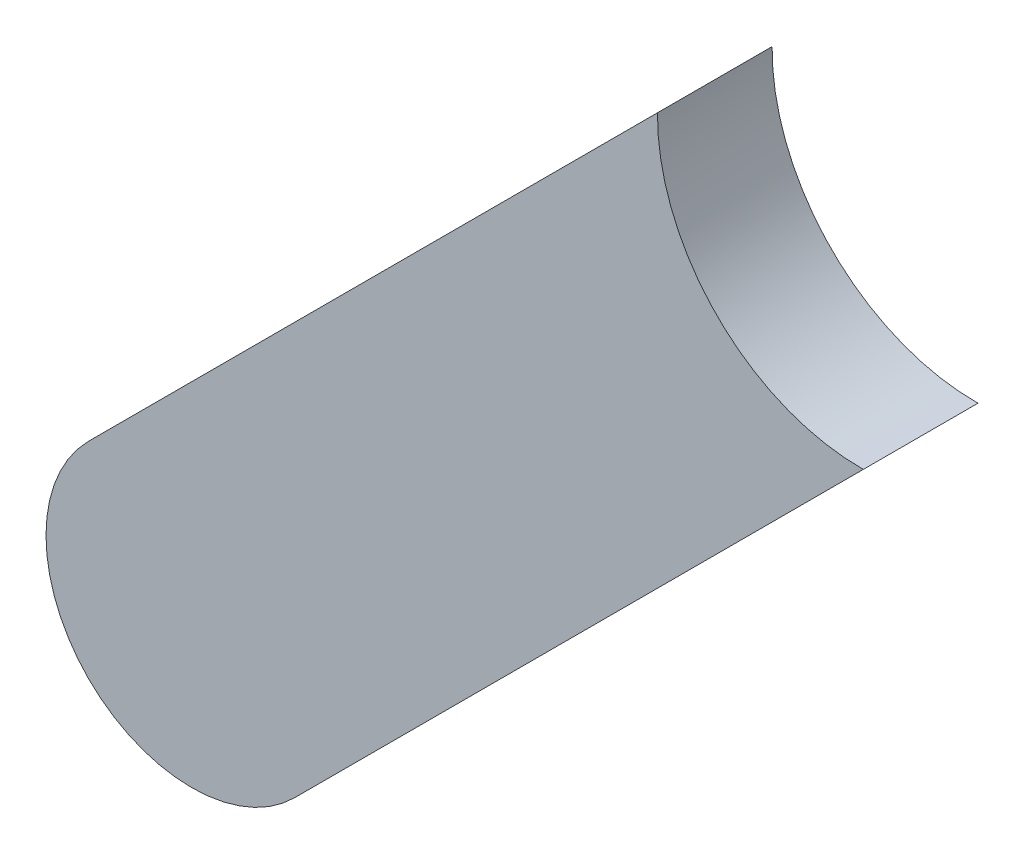
ISO-10303-21;
HEADER;
FILE_DESCRIPTION(('STEP AP214'),'2;1');
FILE_NAME('part.step','',(''),(''),'','','');
FILE_SCHEMA(('AUTOMOTIVE_DESIGN { 1 0 10303 214 1 1 1 1 }'));
ENDSEC;
DATA;
#1=APPLICATION_CONTEXT('core data for automotive mechanical design processes');
#2=APPLICATION_PROTOCOL_DEFINITION('international standard','automotive_design',2000,#1);
#3=PRODUCT_CONTEXT('',#1,'mechanical');
#4=PRODUCT('Part','Part','',(#3));
#5=PRODUCT_RELATED_PRODUCT_CATEGORY('part','',(#4));
#6=PRODUCT_DEFINITION_FORMATION('','',#4);
#7=PRODUCT_DEFINITION_CONTEXT('part definition',#1,'design');
#8=PRODUCT_DEFINITION('design','',#6,#7);
#9=PRODUCT_DEFINITION_SHAPE('','',#8);
#10=(LENGTH_UNIT() NAMED_UNIT(*) SI_UNIT(.MILLI.,.METRE.));
#11=(NAMED_UNIT(*) PLANE_ANGLE_UNIT() SI_UNIT($,.RADIAN.));
#12=(NAMED_UNIT(*) SI_UNIT($,.STERADIAN.) SOLID_ANGLE_UNIT());
#13=UNCERTAINTY_MEASURE_WITH_UNIT(LENGTH_MEASURE(1.E-05),#10,'distance_accuracy_value','');
#14=(GEOMETRIC_REPRESENTATION_CONTEXT(3) GLOBAL_UNCERTAINTY_ASSIGNED_CONTEXT((#13)) GLOBAL_UNIT_ASSIGNED_CONTEXT((#10,
#11,#12)) REPRESENTATION_CONTEXT('',''));
#15=CARTESIAN_POINT('',(0.,0.,0.));
#16=DIRECTION('',(0.,0.,1.));
#17=DIRECTION('',(1.,0.,0.));
#18=AXIS2_PLACEMENT_3D('',#15,#16,#17);
#19=CARTESIAN_POINT('',(146.48360594,112.29159406,0.));
#20=DIRECTION('',(-0.707106781186552,0.707106781186543,0.));
#21=DIRECTION('',(0.707106781186543,0.707106781186552,0.));
#22=AXIS2_PLACEMENT_3D('',#19,#20,#21);
#23=PLANE('',#22);
#24=DIRECTION('',(0.707106781186543,0.707106781186552,0.));
#25=VECTOR('',#24,1.);
#26=CARTESIAN_POINT('',(146.48360594,112.29159406,0.1999996));
#27=LINE('',#26,#25);
#28=CARTESIAN_POINT('',(146.48360594,112.29159406,0.1999996));
#29=VERTEX_POINT('',#28);
#30=CARTESIAN_POINT('',(147.476030412393,113.284018532393,0.1999996));
#31=VERTEX_POINT('',#30);
#32=EDGE_CURVE('E11',#29,#31,#27,.T.);
#33=ORIENTED_EDGE('',*,*,#32,.F.);
#34=DIRECTION('',(0.,0.,1.));
#35=VECTOR('',#34,1.);
#36=CARTESIAN_POINT('',(146.48360594,112.29159406,0.));
#37=LINE('',#36,#35);
#38=CARTESIAN_POINT('',(146.48360594,112.29159406,0.));
#39=VERTEX_POINT('',#38);
#40=EDGE_CURVE('E24',#39,#29,#37,.T.);
#41=ORIENTED_EDGE('',*,*,#40,.F.);
#42=DIRECTION('',(0.707106781186543,0.707106781186552,0.));
#43=VECTOR('',#42,1.);
#44=CARTESIAN_POINT('',(146.48360594,112.29159406,0.));
#45=LINE('',#44,#43);
#46=CARTESIAN_POINT('',(147.476030412393,113.284018532393,0.));
#47=VERTEX_POINT('',#46);
#48=EDGE_CURVE('E75',#39,#47,#45,.T.);
#49=ORIENTED_EDGE('',*,*,#48,.T.);
#50=DIRECTION('',(0.,0.,1.));
#51=VECTOR('',#50,1.);
#52=CARTESIAN_POINT('',(147.476030412393,113.284018532393,0.));
#53=LINE('',#52,#51);
#54=EDGE_CURVE('E37',#47,#31,#53,.T.);
#55=ORIENTED_EDGE('',*,*,#54,.T.);
#56=EDGE_LOOP('',(#33,#41,#49,#55));
#57=FACE_BOUND('',#56,.T.);
#58=ADVANCED_FACE('F17',(#57),#23,.F.);
#59=CARTESIAN_POINT('',(147.4724,113.6396,0.));
#60=DIRECTION('',(0.,0.,-1.));
#61=DIRECTION('',(1.,0.,0.));
#62=AXIS2_PLACEMENT_3D('',#59,#60,#61);
#63=CYLINDRICAL_SURFACE('',#62,0.3556);
#64=DIRECTION('',(0.,0.,1.));
#65=VECTOR('',#64,1.);
#66=CARTESIAN_POINT('',(147.116818532393,113.643230412393,0.));
#67=LINE('',#66,#65);
#68=CARTESIAN_POINT('',(147.116818532393,113.643230412393,0.));
#69=VERTEX_POINT('',#68);
#70=CARTESIAN_POINT('',(147.116818532393,113.643230412393,0.1999996));
#71=VERTEX_POINT('',#70);
#72=EDGE_CURVE('E67',#69,#71,#67,.T.);
#73=ORIENTED_EDGE('',*,*,#72,.T.);
#74=CARTESIAN_POINT('',(147.4724,113.6396,0.1999996));
#75=DIRECTION('',(0.,0.,1.));
#76=DIRECTION('',(1.,0.,0.));
#77=AXIS2_PLACEMENT_3D('',#74,#75,#76);
#78=CIRCLE('',#77,0.3556);
#79=EDGE_CURVE('E82',#71,#31,#78,.T.);
#80=ORIENTED_EDGE('',*,*,#79,.T.);
#81=ORIENTED_EDGE('',*,*,#54,.F.);
#82=CARTESIAN_POINT('',(147.4724,113.6396,0.));
#83=DIRECTION('',(0.,0.,1.));
#84=DIRECTION('',(1.,0.,0.));
#85=AXIS2_PLACEMENT_3D('',#82,#83,#84);
#86=CIRCLE('',#85,0.3556);
#87=EDGE_CURVE('E80',#69,#47,#86,.T.);
#88=ORIENTED_EDGE('',*,*,#87,.F.);
#89=EDGE_LOOP('',(#73,#80,#81,#88));
#90=FACE_BOUND('',#89,.T.);
#91=ADVANCED_FACE('F88',(#90),#63,.F.);
#92=CARTESIAN_POINT('',(147.116818532393,113.643230412393,0.));
#93=DIRECTION('',(0.707106781186548,-0.707106781186548,0.));
#94=DIRECTION('',(-0.707106781186548,-0.707106781186548,0.));
#95=AXIS2_PLACEMENT_3D('',#92,#93,#94);
#96=PLANE('',#95);
#97=DIRECTION('',(-0.707106781186548,-0.707106781186548,0.));
#98=VECTOR('',#97,1.);
#99=CARTESIAN_POINT('',(147.29279406,113.81920594,0.1999996));
#100=LINE('',#99,#98);
#101=CARTESIAN_POINT('',(146.12439406,112.65080594,0.1999996));
#102=VERTEX_POINT('',#101);
#103=EDGE_CURVE('E71',#71,#102,#100,.T.);
#104=ORIENTED_EDGE('',*,*,#103,.F.);
#105=ORIENTED_EDGE('',*,*,#72,.F.);
#106=DIRECTION('',(-0.707106781186548,-0.707106781186548,0.));
#107=VECTOR('',#106,1.);
#108=CARTESIAN_POINT('',(147.29279406,113.81920594,0.));
#109=LINE('',#108,#107);
#110=CARTESIAN_POINT('',(146.12439406,112.65080594,0.));
#111=VERTEX_POINT('',#110);
#112=EDGE_CURVE('E63',#69,#111,#109,.T.);
#113=ORIENTED_EDGE('',*,*,#112,.T.);
#114=DIRECTION('',(0.,0.,1.));
#115=VECTOR('',#114,1.);
#116=CARTESIAN_POINT('',(146.12439406,112.65080594,0.));
#117=LINE('',#116,#115);
#118=EDGE_CURVE('E53',#111,#102,#117,.T.);
#119=ORIENTED_EDGE('',*,*,#118,.T.);
#120=EDGE_LOOP('',(#104,#105,#113,#119));
#121=FACE_BOUND('',#120,.T.);
#122=ADVANCED_FACE('F66',(#121),#96,.F.);
#123=CARTESIAN_POINT('',(146.304,112.4712,0.));
#124=DIRECTION('',(0.,0.,-1.));
#125=DIRECTION('',(-0.707106781186492,0.707106781186604,0.));
#126=AXIS2_PLACEMENT_3D('',#123,#124,#125);
#127=CYLINDRICAL_SURFACE('',#126,0.254001156230771);
#128=CARTESIAN_POINT('',(146.304,112.4712,0.1999996));
#129=DIRECTION('',(0.,0.,1.));
#130=DIRECTION('',(-0.707106781186492,0.707106781186604,0.));
#131=AXIS2_PLACEMENT_3D('',#128,#129,#130);
#132=CIRCLE('',#131,0.254001156230771);
#133=EDGE_CURVE('E59',#102,#29,#132,.T.);
#134=ORIENTED_EDGE('',*,*,#133,.F.);
#135=ORIENTED_EDGE('',*,*,#118,.F.);
#136=CARTESIAN_POINT('',(146.304,112.4712,0.));
#137=DIRECTION('',(0.,0.,1.));
#138=DIRECTION('',(-0.707106781186492,0.707106781186604,0.));
#139=AXIS2_PLACEMENT_3D('',#136,#137,#138);
#140=CIRCLE('',#139,0.254001156230771);
#141=EDGE_CURVE('E57',#111,#39,#140,.T.);
#142=ORIENTED_EDGE('',*,*,#141,.T.);
#143=ORIENTED_EDGE('',*,*,#40,.T.);
#144=EDGE_LOOP('',(#134,#135,#142,#143));
#145=FACE_BOUND('',#144,.T.);
#146=ADVANCED_FACE('F55',(#145),#127,.T.);
#147=CARTESIAN_POINT('',(146.48360594,112.29159406,0.));
#148=DIRECTION('',(0.,0.,-1.));
#149=DIRECTION('',(-1.,0.,0.));
#150=AXIS2_PLACEMENT_3D('',#147,#148,#149);
#151=PLANE('',#150);
#152=ORIENTED_EDGE('',*,*,#48,.F.);
#153=ORIENTED_EDGE('',*,*,#141,.F.);
#154=ORIENTED_EDGE('',*,*,#112,.F.);
#155=ORIENTED_EDGE('',*,*,#87,.T.);
#156=EDGE_LOOP('',(#152,#153,#154,#155));
#157=FACE_BOUND('',#156,.T.);
#158=ADVANCED_FACE('F74',(#157),#151,.T.);
#159=CARTESIAN_POINT('',(146.48360594,112.29159406,0.1999996));
#160=DIRECTION('',(0.,0.,-1.));
#161=DIRECTION('',(-1.,0.,0.));
#162=AXIS2_PLACEMENT_3D('',#159,#160,#161);
#163=PLANE('',#162);
#164=ORIENTED_EDGE('',*,*,#133,.T.);
#165=ORIENTED_EDGE('',*,*,#32,.T.);
#166=ORIENTED_EDGE('',*,*,#79,.F.);
#167=ORIENTED_EDGE('',*,*,#103,.T.);
#168=EDGE_LOOP('',(#164,#165,#166,#167));
#169=FACE_BOUND('',#168,.T.);
#170=ADVANCED_FACE('F91',(#169),#163,.F.);
#171=CLOSED_SHELL('',(#58,#91,#122,#146,#158,#170));
#172=MANIFOLD_SOLID_BREP('B1',#171);
#173=ADVANCED_BREP_SHAPE_REPRESENTATION('',(#18,#172),#14);
#174=SHAPE_DEFINITION_REPRESENTATION(#9,#173);
ENDSEC;
END-ISO-10303-21;
